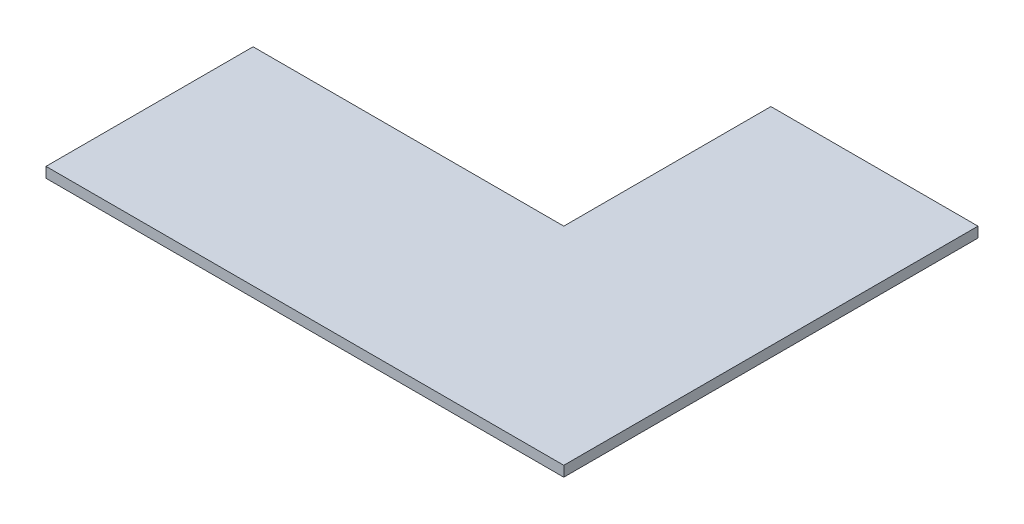
ISO-10303-21;
HEADER;
FILE_DESCRIPTION(('STEP AP214'),'2;1');
FILE_NAME('part.step','',(''),(''),'','','');
FILE_SCHEMA(('AUTOMOTIVE_DESIGN { 1 0 10303 214 1 1 1 1 }'));
ENDSEC;
DATA;
#1=APPLICATION_CONTEXT('core data for automotive mechanical design processes');
#2=APPLICATION_PROTOCOL_DEFINITION('international standard','automotive_design',2000,#1);
#3=PRODUCT_CONTEXT('',#1,'mechanical');
#4=PRODUCT('Part','Part','',(#3));
#5=PRODUCT_RELATED_PRODUCT_CATEGORY('part','',(#4));
#6=PRODUCT_DEFINITION_FORMATION('','',#4);
#7=PRODUCT_DEFINITION_CONTEXT('part definition',#1,'design');
#8=PRODUCT_DEFINITION('design','',#6,#7);
#9=PRODUCT_DEFINITION_SHAPE('','',#8);
#10=(LENGTH_UNIT() NAMED_UNIT(*) SI_UNIT(.MILLI.,.METRE.));
#11=(NAMED_UNIT(*) PLANE_ANGLE_UNIT() SI_UNIT($,.RADIAN.));
#12=(NAMED_UNIT(*) SI_UNIT($,.STERADIAN.) SOLID_ANGLE_UNIT());
#13=UNCERTAINTY_MEASURE_WITH_UNIT(LENGTH_MEASURE(1.E-05),#10,'distance_accuracy_value','');
#14=(GEOMETRIC_REPRESENTATION_CONTEXT(3) GLOBAL_UNCERTAINTY_ASSIGNED_CONTEXT((#13)) GLOBAL_UNIT_ASSIGNED_CONTEXT((#10,
#11,#12)) REPRESENTATION_CONTEXT('',''));
#15=CARTESIAN_POINT('',(0.,0.,0.));
#16=DIRECTION('',(0.,0.,1.));
#17=DIRECTION('',(1.,0.,0.));
#18=AXIS2_PLACEMENT_3D('',#15,#16,#17);
#19=CARTESIAN_POINT('',(-60.,-2.,0.));
#20=DIRECTION('',(0.,0.,-1.));
#21=DIRECTION('',(-1.,0.,0.));
#22=AXIS2_PLACEMENT_3D('',#19,#20,#21);
#23=PLANE('',#22);
#24=DIRECTION('',(-1.,0.,0.));
#25=VECTOR('',#24,1.);
#26=CARTESIAN_POINT('',(-60.,0.,0.));
#27=LINE('',#26,#25);
#28=CARTESIAN_POINT('',(0.,0.,0.));
#29=VERTEX_POINT('',#28);
#30=CARTESIAN_POINT('',(-60.,0.,0.));
#31=VERTEX_POINT('',#30);
#32=EDGE_CURVE('E122',#29,#31,#27,.T.);
#33=ORIENTED_EDGE('',*,*,#32,.F.);
#34=DIRECTION('',(0.,1.,0.));
#35=VECTOR('',#34,1.);
#36=CARTESIAN_POINT('',(0.,-2.,0.));
#37=LINE('',#36,#35);
#38=CARTESIAN_POINT('',(0.,-2.,0.));
#39=VERTEX_POINT('',#38);
#40=EDGE_CURVE('E11',#39,#29,#37,.T.);
#41=ORIENTED_EDGE('',*,*,#40,.F.);
#42=DIRECTION('',(-1.,0.,0.));
#43=VECTOR('',#42,1.);
#44=CARTESIAN_POINT('',(-60.,-2.,0.));
#45=LINE('',#44,#43);
#46=CARTESIAN_POINT('',(-60.,-2.,0.));
#47=VERTEX_POINT('',#46);
#48=EDGE_CURVE('E136',#39,#47,#45,.T.);
#49=ORIENTED_EDGE('',*,*,#48,.T.);
#50=DIRECTION('',(0.,1.,0.));
#51=VECTOR('',#50,1.);
#52=CARTESIAN_POINT('',(-60.,-2.,0.));
#53=LINE('',#52,#51);
#54=EDGE_CURVE('E40',#47,#31,#53,.T.);
#55=ORIENTED_EDGE('',*,*,#54,.T.);
#56=EDGE_LOOP('',(#33,#41,#49,#55));
#57=FACE_BOUND('',#56,.T.);
#58=ADVANCED_FACE('F37',(#57),#23,.T.);
#59=CARTESIAN_POINT('',(0.,-2.,0.));
#60=DIRECTION('',(-1.,0.,0.));
#61=DIRECTION('',(0.,0.,1.));
#62=AXIS2_PLACEMENT_3D('',#59,#60,#61);
#63=PLANE('',#62);
#64=DIRECTION('',(0.,0.,1.));
#65=VECTOR('',#64,1.);
#66=CARTESIAN_POINT('',(0.,0.,0.));
#67=LINE('',#66,#65);
#68=CARTESIAN_POINT('',(0.,0.,-40.));
#69=VERTEX_POINT('',#68);
#70=EDGE_CURVE('E134',#69,#29,#67,.T.);
#71=ORIENTED_EDGE('',*,*,#70,.F.);
#72=DIRECTION('',(0.,1.,0.));
#73=VECTOR('',#72,1.);
#74=CARTESIAN_POINT('',(0.,-2.,-40.));
#75=LINE('',#74,#73);
#76=CARTESIAN_POINT('',(0.,-2.,-40.));
#77=VERTEX_POINT('',#76);
#78=EDGE_CURVE('E46',#77,#69,#75,.T.);
#79=ORIENTED_EDGE('',*,*,#78,.F.);
#80=DIRECTION('',(0.,0.,1.));
#81=VECTOR('',#80,1.);
#82=CARTESIAN_POINT('',(0.,-2.,0.));
#83=LINE('',#82,#81);
#84=EDGE_CURVE('E112',#77,#39,#83,.T.);
#85=ORIENTED_EDGE('',*,*,#84,.T.);
#86=ORIENTED_EDGE('',*,*,#40,.T.);
#87=EDGE_LOOP('',(#71,#79,#85,#86));
#88=FACE_BOUND('',#87,.T.);
#89=ADVANCED_FACE('F144',(#88),#63,.T.);
#90=CARTESIAN_POINT('',(0.,-2.,-40.));
#91=DIRECTION('',(0.,0.,-1.));
#92=DIRECTION('',(-1.,0.,0.));
#93=AXIS2_PLACEMENT_3D('',#90,#91,#92);
#94=PLANE('',#93);
#95=DIRECTION('',(-1.,0.,0.));
#96=VECTOR('',#95,1.);
#97=CARTESIAN_POINT('',(0.,0.,-40.));
#98=LINE('',#97,#96);
#99=CARTESIAN_POINT('',(40.,0.,-40.));
#100=VERTEX_POINT('',#99);
#101=EDGE_CURVE('E99',#100,#69,#98,.T.);
#102=ORIENTED_EDGE('',*,*,#101,.F.);
#103=DIRECTION('',(0.,1.,0.));
#104=VECTOR('',#103,1.);
#105=CARTESIAN_POINT('',(40.,-2.,-40.));
#106=LINE('',#105,#104);
#107=CARTESIAN_POINT('',(40.,-2.,-40.));
#108=VERTEX_POINT('',#107);
#109=EDGE_CURVE('E94',#108,#100,#106,.T.);
#110=ORIENTED_EDGE('',*,*,#109,.F.);
#111=DIRECTION('',(-1.,0.,0.));
#112=VECTOR('',#111,1.);
#113=CARTESIAN_POINT('',(0.,-2.,-40.));
#114=LINE('',#113,#112);
#115=EDGE_CURVE('E97',#108,#77,#114,.T.);
#116=ORIENTED_EDGE('',*,*,#115,.T.);
#117=ORIENTED_EDGE('',*,*,#78,.T.);
#118=EDGE_LOOP('',(#102,#110,#116,#117));
#119=FACE_BOUND('',#118,.T.);
#120=ADVANCED_FACE('F96',(#119),#94,.T.);
#121=CARTESIAN_POINT('',(40.,-2.,-40.));
#122=DIRECTION('',(1.,0.,0.));
#123=DIRECTION('',(0.,0.,-1.));
#124=AXIS2_PLACEMENT_3D('',#121,#122,#123);
#125=PLANE('',#124);
#126=DIRECTION('',(0.,0.,-1.));
#127=VECTOR('',#126,1.);
#128=CARTESIAN_POINT('',(40.,0.,-40.));
#129=LINE('',#128,#127);
#130=CARTESIAN_POINT('',(40.,0.,40.));
#131=VERTEX_POINT('',#130);
#132=EDGE_CURVE('E131',#131,#100,#129,.T.);
#133=ORIENTED_EDGE('',*,*,#132,.F.);
#134=DIRECTION('',(0.,1.,0.));
#135=VECTOR('',#134,1.);
#136=CARTESIAN_POINT('',(40.,-2.,40.));
#137=LINE('',#136,#135);
#138=CARTESIAN_POINT('',(40.,-2.,40.));
#139=VERTEX_POINT('',#138);
#140=EDGE_CURVE('E104',#139,#131,#137,.T.);
#141=ORIENTED_EDGE('',*,*,#140,.F.);
#142=DIRECTION('',(0.,0.,-1.));
#143=VECTOR('',#142,1.);
#144=CARTESIAN_POINT('',(40.,-2.,-40.));
#145=LINE('',#144,#143);
#146=EDGE_CURVE('E110',#139,#108,#145,.T.);
#147=ORIENTED_EDGE('',*,*,#146,.T.);
#148=ORIENTED_EDGE('',*,*,#109,.T.);
#149=EDGE_LOOP('',(#133,#141,#147,#148));
#150=FACE_BOUND('',#149,.T.);
#151=ADVANCED_FACE('F114',(#150),#125,.T.);
#152=CARTESIAN_POINT('',(40.,-2.,40.));
#153=DIRECTION('',(0.,0.,1.));
#154=DIRECTION('',(1.,0.,0.));
#155=AXIS2_PLACEMENT_3D('',#152,#153,#154);
#156=PLANE('',#155);
#157=DIRECTION('',(1.,0.,0.));
#158=VECTOR('',#157,1.);
#159=CARTESIAN_POINT('',(40.,0.,40.));
#160=LINE('',#159,#158);
#161=CARTESIAN_POINT('',(-60.,0.,40.));
#162=VERTEX_POINT('',#161);
#163=EDGE_CURVE('E128',#162,#131,#160,.T.);
#164=ORIENTED_EDGE('',*,*,#163,.F.);
#165=DIRECTION('',(0.,1.,0.));
#166=VECTOR('',#165,1.);
#167=CARTESIAN_POINT('',(-60.,-2.,40.));
#168=LINE('',#167,#166);
#169=CARTESIAN_POINT('',(-60.,-2.,40.));
#170=VERTEX_POINT('',#169);
#171=EDGE_CURVE('E139',#170,#162,#168,.T.);
#172=ORIENTED_EDGE('',*,*,#171,.F.);
#173=DIRECTION('',(1.,0.,0.));
#174=VECTOR('',#173,1.);
#175=CARTESIAN_POINT('',(40.,-2.,40.));
#176=LINE('',#175,#174);
#177=EDGE_CURVE('E115',#170,#139,#176,.T.);
#178=ORIENTED_EDGE('',*,*,#177,.T.);
#179=ORIENTED_EDGE('',*,*,#140,.T.);
#180=EDGE_LOOP('',(#164,#172,#178,#179));
#181=FACE_BOUND('',#180,.T.);
#182=ADVANCED_FACE('F157',(#181),#156,.T.);
#183=CARTESIAN_POINT('',(-60.,-2.,40.));
#184=DIRECTION('',(-1.,0.,0.));
#185=DIRECTION('',(0.,0.,1.));
#186=AXIS2_PLACEMENT_3D('',#183,#184,#185);
#187=PLANE('',#186);
#188=DIRECTION('',(0.,0.,1.));
#189=VECTOR('',#188,1.);
#190=CARTESIAN_POINT('',(-60.,0.,40.));
#191=LINE('',#190,#189);
#192=EDGE_CURVE('E125',#31,#162,#191,.T.);
#193=ORIENTED_EDGE('',*,*,#192,.F.);
#194=ORIENTED_EDGE('',*,*,#54,.F.);
#195=DIRECTION('',(0.,0.,1.));
#196=VECTOR('',#195,1.);
#197=CARTESIAN_POINT('',(-60.,-2.,40.));
#198=LINE('',#197,#196);
#199=EDGE_CURVE('E117',#47,#170,#198,.T.);
#200=ORIENTED_EDGE('',*,*,#199,.T.);
#201=ORIENTED_EDGE('',*,*,#171,.T.);
#202=EDGE_LOOP('',(#193,#194,#200,#201));
#203=FACE_BOUND('',#202,.T.);
#204=ADVANCED_FACE('F141',(#203),#187,.T.);
#205=CARTESIAN_POINT('',(0.,-2.,0.));
#206=DIRECTION('',(0.,1.,0.));
#207=DIRECTION('',(0.,0.,1.));
#208=AXIS2_PLACEMENT_3D('',#205,#206,#207);
#209=PLANE('',#208);
#210=ORIENTED_EDGE('',*,*,#48,.F.);
#211=ORIENTED_EDGE('',*,*,#84,.F.);
#212=ORIENTED_EDGE('',*,*,#115,.F.);
#213=ORIENTED_EDGE('',*,*,#146,.F.);
#214=ORIENTED_EDGE('',*,*,#177,.F.);
#215=ORIENTED_EDGE('',*,*,#199,.F.);
#216=EDGE_LOOP('',(#210,#211,#212,#213,#214,#215));
#217=FACE_BOUND('',#216,.T.);
#218=ADVANCED_FACE('F108',(#217),#209,.F.);
#219=CARTESIAN_POINT('',(0.,0.,0.));
#220=DIRECTION('',(0.,1.,0.));
#221=DIRECTION('',(0.,0.,1.));
#222=AXIS2_PLACEMENT_3D('',#219,#220,#221);
#223=PLANE('',#222);
#224=ORIENTED_EDGE('',*,*,#32,.T.);
#225=ORIENTED_EDGE('',*,*,#192,.T.);
#226=ORIENTED_EDGE('',*,*,#163,.T.);
#227=ORIENTED_EDGE('',*,*,#132,.T.);
#228=ORIENTED_EDGE('',*,*,#101,.T.);
#229=ORIENTED_EDGE('',*,*,#70,.T.);
#230=EDGE_LOOP('',(#224,#225,#226,#227,#228,#229));
#231=FACE_BOUND('',#230,.T.);
#232=ADVANCED_FACE('F143',(#231),#223,.T.);
#233=CLOSED_SHELL('',(#58,#89,#120,#151,#182,#204,#218,#232));
#234=MANIFOLD_SOLID_BREP('B2',#233);
#235=ADVANCED_BREP_SHAPE_REPRESENTATION('',(#18,#234),#14);
#236=SHAPE_DEFINITION_REPRESENTATION(#9,#235);
ENDSEC;
END-ISO-10303-21;
